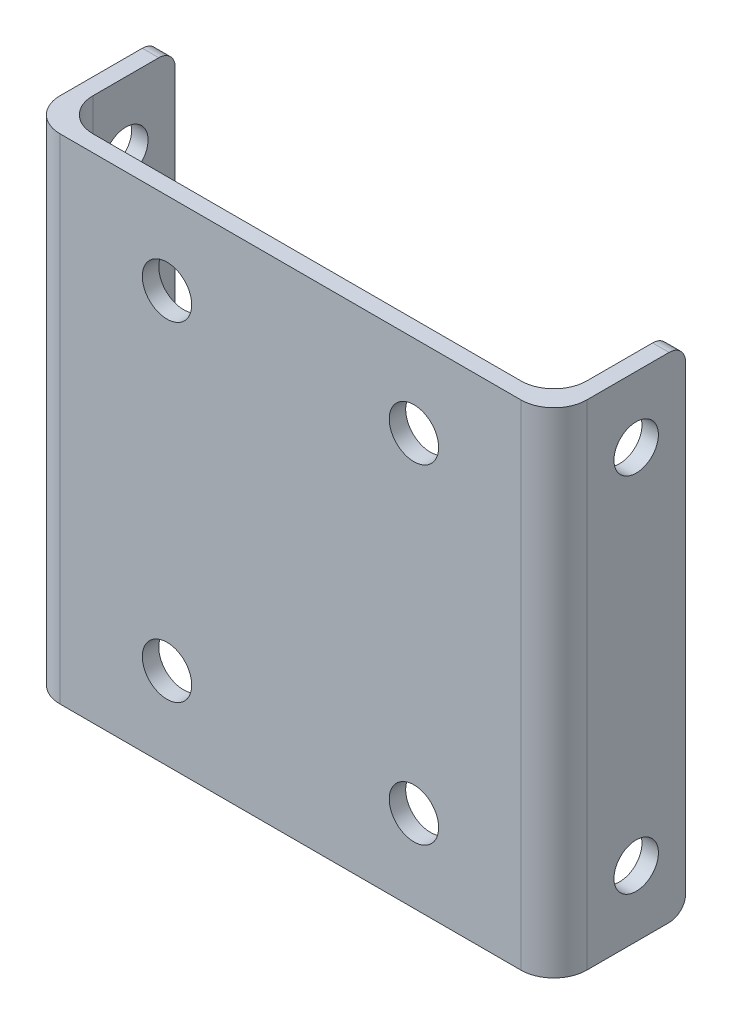
ISO-10303-21;
HEADER;
FILE_DESCRIPTION(('STEP AP214'),'2;1');
FILE_NAME('part.step','',(''),(''),'','','');
FILE_SCHEMA(('AUTOMOTIVE_DESIGN { 1 0 10303 214 1 1 1 1 }'));
ENDSEC;
DATA;
#1=APPLICATION_CONTEXT('core data for automotive mechanical design processes');
#2=APPLICATION_PROTOCOL_DEFINITION('international standard','automotive_design',2000,#1);
#3=PRODUCT_CONTEXT('',#1,'mechanical');
#4=PRODUCT('Part','Part','',(#3));
#5=PRODUCT_RELATED_PRODUCT_CATEGORY('part','',(#4));
#6=PRODUCT_DEFINITION_FORMATION('','',#4);
#7=PRODUCT_DEFINITION_CONTEXT('part definition',#1,'design');
#8=PRODUCT_DEFINITION('design','',#6,#7);
#9=PRODUCT_DEFINITION_SHAPE('','',#8);
#10=(LENGTH_UNIT() NAMED_UNIT(*) SI_UNIT(.MILLI.,.METRE.));
#11=(NAMED_UNIT(*) PLANE_ANGLE_UNIT() SI_UNIT($,.RADIAN.));
#12=(NAMED_UNIT(*) SI_UNIT($,.STERADIAN.) SOLID_ANGLE_UNIT());
#13=UNCERTAINTY_MEASURE_WITH_UNIT(LENGTH_MEASURE(1.E-05),#10,'distance_accuracy_value','');
#14=(GEOMETRIC_REPRESENTATION_CONTEXT(3) GLOBAL_UNCERTAINTY_ASSIGNED_CONTEXT((#13)) GLOBAL_UNIT_ASSIGNED_CONTEXT((#10,
#11,#12)) REPRESENTATION_CONTEXT('',''));
#15=CARTESIAN_POINT('',(0.,0.,0.));
#16=DIRECTION('',(0.,0.,1.));
#17=DIRECTION('',(1.,0.,0.));
#18=AXIS2_PLACEMENT_3D('',#15,#16,#17);
#19=CARTESIAN_POINT('',(9.50000000000006,30.,-0.5));
#20=DIRECTION('',(-1.,0.,0.));
#21=DIRECTION('',(0.,0.,1.));
#22=AXIS2_PLACEMENT_3D('',#19,#20,#21);
#23=PLANE('',#22);
#24=CARTESIAN_POINT('',(9.50000000000006,4.,-4.5));
#25=DIRECTION('',(1.,0.,0.));
#26=DIRECTION('',(0.,0.,-1.));
#27=AXIS2_PLACEMENT_3D('',#24,#25,#26);
#28=CIRCLE('',#27,1.35);
#29=CARTESIAN_POINT('',(9.50000000000006,4.,-5.85));
#30=VERTEX_POINT('',#29);
#31=EDGE_CURVE('E446',#30,#30,#28,.T.);
#32=ORIENTED_EDGE('',*,*,#31,.F.);
#33=EDGE_LOOP('',(#32));
#34=FACE_BOUND('',#33,.T.);
#35=CARTESIAN_POINT('',(9.50000000000006,26.,-4.5));
#36=DIRECTION('',(1.,0.,0.));
#37=DIRECTION('',(0.,0.,-1.));
#38=AXIS2_PLACEMENT_3D('',#35,#36,#37);
#39=CIRCLE('',#38,1.35);
#40=CARTESIAN_POINT('',(9.50000000000006,26.,-5.85));
#41=VERTEX_POINT('',#40);
#42=EDGE_CURVE('E447',#41,#41,#39,.T.);
#43=ORIENTED_EDGE('',*,*,#42,.F.);
#44=EDGE_LOOP('',(#43));
#45=FACE_BOUND('',#44,.T.);
#46=DIRECTION('',(0.,0.,-1.));
#47=VECTOR('',#46,1.);
#48=CARTESIAN_POINT('',(9.50000000000006,0.,-0.5));
#49=LINE('',#48,#47);
#50=CARTESIAN_POINT('',(9.50000000000006,0.,-1.5));
#51=VERTEX_POINT('',#50);
#52=CARTESIAN_POINT('',(9.50000000000006,0.,-6.5));
#53=VERTEX_POINT('',#52);
#54=EDGE_CURVE('E273',#51,#53,#49,.T.);
#55=ORIENTED_EDGE('',*,*,#54,.T.);
#56=CARTESIAN_POINT('',(9.50000000000006,1.,-6.5));
#57=DIRECTION('',(-1.,0.,0.));
#58=DIRECTION('',(0.,0.,1.));
#59=AXIS2_PLACEMENT_3D('',#56,#57,#58);
#60=CIRCLE('',#59,1.);
#61=CARTESIAN_POINT('',(9.50000000000006,1.,-7.5));
#62=VERTEX_POINT('',#61);
#63=EDGE_CURVE('E11',#53,#62,#60,.F.);
#64=ORIENTED_EDGE('',*,*,#63,.T.);
#65=DIRECTION('',(0.,-1.,0.));
#66=VECTOR('',#65,1.);
#67=CARTESIAN_POINT('',(9.50000000000006,30.,-7.5));
#68=LINE('',#67,#66);
#69=CARTESIAN_POINT('',(9.50000000000006,29.,-7.5));
#70=VERTEX_POINT('',#69);
#71=EDGE_CURVE('E189',#70,#62,#68,.T.);
#72=ORIENTED_EDGE('',*,*,#71,.F.);
#73=CARTESIAN_POINT('',(9.50000000000006,29.,-6.5));
#74=DIRECTION('',(-1.,0.,0.));
#75=DIRECTION('',(0.,0.,1.));
#76=AXIS2_PLACEMENT_3D('',#73,#74,#75);
#77=CIRCLE('',#76,1.);
#78=CARTESIAN_POINT('',(9.50000000000006,30.,-6.5));
#79=VERTEX_POINT('',#78);
#80=EDGE_CURVE('E40',#70,#79,#77,.F.);
#81=ORIENTED_EDGE('',*,*,#80,.T.);
#82=DIRECTION('',(0.,0.,-1.));
#83=VECTOR('',#82,1.);
#84=CARTESIAN_POINT('',(9.50000000000006,30.,-0.5));
#85=LINE('',#84,#83);
#86=CARTESIAN_POINT('',(9.50000000000006,30.,-1.5));
#87=VERTEX_POINT('',#86);
#88=EDGE_CURVE('E170',#87,#79,#85,.T.);
#89=ORIENTED_EDGE('',*,*,#88,.F.);
#90=DIRECTION('',(0.,-1.,0.));
#91=VECTOR('',#90,1.);
#92=CARTESIAN_POINT('',(9.50000000000006,30.,-1.5));
#93=LINE('',#92,#91);
#94=EDGE_CURVE('E206',#87,#51,#93,.T.);
#95=ORIENTED_EDGE('',*,*,#94,.T.);
#96=EDGE_LOOP('',(#55,#64,#72,#81,#89,#95));
#97=FACE_BOUND('',#96,.T.);
#98=ADVANCED_FACE('F32',(#34,#45,#97),#23,.F.);
#99=CARTESIAN_POINT('',(9.50000000000006,30.,-7.5));
#100=DIRECTION('',(0.,0.,1.));
#101=DIRECTION('',(1.,0.,0.));
#102=AXIS2_PLACEMENT_3D('',#99,#100,#101);
#103=PLANE('',#102);
#104=ORIENTED_EDGE('',*,*,#71,.T.);
#105=DIRECTION('',(-1.,0.,0.));
#106=VECTOR('',#105,1.);
#107=CARTESIAN_POINT('',(9.50000000000006,1.,-7.5));
#108=LINE('',#107,#106);
#109=CARTESIAN_POINT('',(8.50000000000006,1.,-7.5));
#110=VERTEX_POINT('',#109);
#111=EDGE_CURVE('E245',#62,#110,#108,.T.);
#112=ORIENTED_EDGE('',*,*,#111,.T.);
#113=DIRECTION('',(0.,-1.,0.));
#114=VECTOR('',#113,1.);
#115=CARTESIAN_POINT('',(8.50000000000006,30.,-7.5));
#116=LINE('',#115,#114);
#117=CARTESIAN_POINT('',(8.50000000000006,29.,-7.5));
#118=VERTEX_POINT('',#117);
#119=EDGE_CURVE('E186',#118,#110,#116,.T.);
#120=ORIENTED_EDGE('',*,*,#119,.F.);
#121=DIRECTION('',(-1.,0.,0.));
#122=VECTOR('',#121,1.);
#123=CARTESIAN_POINT('',(9.50000000000006,29.,-7.5));
#124=LINE('',#123,#122);
#125=EDGE_CURVE('E52',#118,#70,#124,.F.);
#126=ORIENTED_EDGE('',*,*,#125,.T.);
#127=EDGE_LOOP('',(#104,#112,#120,#126));
#128=FACE_BOUND('',#127,.T.);
#129=ADVANCED_FACE('F263',(#128),#103,.F.);
#130=CARTESIAN_POINT('',(8.50000000000006,30.,-0.5));
#131=DIRECTION('',(1.,0.,0.));
#132=DIRECTION('',(0.,0.,-1.));
#133=AXIS2_PLACEMENT_3D('',#130,#131,#132);
#134=PLANE('',#133);
#135=CARTESIAN_POINT('',(8.50000000000006,4.,-4.5));
#136=DIRECTION('',(1.,0.,0.));
#137=DIRECTION('',(0.,0.,-1.));
#138=AXIS2_PLACEMENT_3D('',#135,#136,#137);
#139=CIRCLE('',#138,1.35);
#140=CARTESIAN_POINT('',(8.50000000000006,4.,-5.85));
#141=VERTEX_POINT('',#140);
#142=EDGE_CURVE('E370',#141,#141,#139,.T.);
#143=ORIENTED_EDGE('',*,*,#142,.T.);
#144=EDGE_LOOP('',(#143));
#145=FACE_BOUND('',#144,.T.);
#146=CARTESIAN_POINT('',(8.50000000000006,26.,-4.5));
#147=DIRECTION('',(1.,0.,0.));
#148=DIRECTION('',(0.,0.,-1.));
#149=AXIS2_PLACEMENT_3D('',#146,#147,#148);
#150=CIRCLE('',#149,1.35);
#151=CARTESIAN_POINT('',(8.50000000000006,26.,-5.85));
#152=VERTEX_POINT('',#151);
#153=EDGE_CURVE('E373',#152,#152,#150,.T.);
#154=ORIENTED_EDGE('',*,*,#153,.T.);
#155=EDGE_LOOP('',(#154));
#156=FACE_BOUND('',#155,.T.);
#157=ORIENTED_EDGE('',*,*,#119,.T.);
#158=CARTESIAN_POINT('',(8.50000000000006,1.,-6.5));
#159=DIRECTION('',(1.,0.,0.));
#160=DIRECTION('',(0.,0.,-1.));
#161=AXIS2_PLACEMENT_3D('',#158,#159,#160);
#162=CIRCLE('',#161,1.);
#163=CARTESIAN_POINT('',(8.50000000000006,0.,-6.5));
#164=VERTEX_POINT('',#163);
#165=EDGE_CURVE('E250',#110,#164,#162,.F.);
#166=ORIENTED_EDGE('',*,*,#165,.T.);
#167=DIRECTION('',(0.,0.,1.));
#168=VECTOR('',#167,1.);
#169=CARTESIAN_POINT('',(8.50000000000006,0.,-0.5));
#170=LINE('',#169,#168);
#171=CARTESIAN_POINT('',(8.50000000000006,0.,-2.5));
#172=VERTEX_POINT('',#171);
#173=EDGE_CURVE('E269',#164,#172,#170,.T.);
#174=ORIENTED_EDGE('',*,*,#173,.T.);
#175=DIRECTION('',(0.,-1.,0.));
#176=VECTOR('',#175,1.);
#177=CARTESIAN_POINT('',(8.50000000000006,30.,-2.5));
#178=LINE('',#177,#176);
#179=CARTESIAN_POINT('',(8.50000000000006,30.,-2.5));
#180=VERTEX_POINT('',#179);
#181=EDGE_CURVE('E209',#172,#180,#178,.F.);
#182=ORIENTED_EDGE('',*,*,#181,.T.);
#183=DIRECTION('',(0.,0.,1.));
#184=VECTOR('',#183,1.);
#185=CARTESIAN_POINT('',(8.50000000000006,30.,-0.5));
#186=LINE('',#185,#184);
#187=CARTESIAN_POINT('',(8.50000000000006,30.,-6.5));
#188=VERTEX_POINT('',#187);
#189=EDGE_CURVE('E174',#188,#180,#186,.T.);
#190=ORIENTED_EDGE('',*,*,#189,.F.);
#191=CARTESIAN_POINT('',(8.50000000000006,29.,-6.5));
#192=DIRECTION('',(1.,0.,0.));
#193=DIRECTION('',(0.,0.,-1.));
#194=AXIS2_PLACEMENT_3D('',#191,#192,#193);
#195=CIRCLE('',#194,1.);
#196=EDGE_CURVE('E248',#188,#118,#195,.F.);
#197=ORIENTED_EDGE('',*,*,#196,.T.);
#198=EDGE_LOOP('',(#157,#166,#174,#182,#190,#197));
#199=FACE_BOUND('',#198,.T.);
#200=ADVANCED_FACE('F262',(#145,#156,#199),#134,.F.);
#201=CARTESIAN_POINT('',(-21.4999999999999,30.,-0.500000000000001));
#202=DIRECTION('',(0.,0.,1.));
#203=DIRECTION('',(1.,0.,0.));
#204=AXIS2_PLACEMENT_3D('',#201,#202,#203);
#205=PLANE('',#204);
#206=CARTESIAN_POINT('',(-13.9999999999999,5.,-0.500000000000001));
#207=DIRECTION('',(0.,0.,1.));
#208=DIRECTION('',(1.,0.,0.));
#209=AXIS2_PLACEMENT_3D('',#206,#207,#208);
#210=CIRCLE('',#209,1.5);
#211=CARTESIAN_POINT('',(-12.4999999999999,5.,-0.500000000000001));
#212=VERTEX_POINT('',#211);
#213=EDGE_CURVE('E379',#212,#212,#210,.T.);
#214=ORIENTED_EDGE('',*,*,#213,.T.);
#215=EDGE_LOOP('',(#214));
#216=FACE_BOUND('',#215,.T.);
#217=CARTESIAN_POINT('',(1.00000000000006,5.,-0.5));
#218=DIRECTION('',(0.,0.,1.));
#219=DIRECTION('',(1.,0.,0.));
#220=AXIS2_PLACEMENT_3D('',#217,#218,#219);
#221=CIRCLE('',#220,1.5);
#222=CARTESIAN_POINT('',(2.50000000000006,5.,-0.5));
#223=VERTEX_POINT('',#222);
#224=EDGE_CURVE('E391',#223,#223,#221,.T.);
#225=ORIENTED_EDGE('',*,*,#224,.T.);
#226=EDGE_LOOP('',(#225));
#227=FACE_BOUND('',#226,.T.);
#228=CARTESIAN_POINT('',(1.00000000000006,25.,-0.5));
#229=DIRECTION('',(0.,0.,1.));
#230=DIRECTION('',(1.,0.,0.));
#231=AXIS2_PLACEMENT_3D('',#228,#229,#230);
#232=CIRCLE('',#231,1.5);
#233=CARTESIAN_POINT('',(2.50000000000005,25.,-0.5));
#234=VERTEX_POINT('',#233);
#235=EDGE_CURVE('E397',#234,#234,#232,.T.);
#236=ORIENTED_EDGE('',*,*,#235,.T.);
#237=EDGE_LOOP('',(#236));
#238=FACE_BOUND('',#237,.T.);
#239=CARTESIAN_POINT('',(-13.9999999999999,25.,-0.500000000000001));
#240=DIRECTION('',(0.,0.,1.));
#241=DIRECTION('',(1.,0.,0.));
#242=AXIS2_PLACEMENT_3D('',#239,#240,#241);
#243=CIRCLE('',#242,1.5);
#244=CARTESIAN_POINT('',(-12.4999999999999,25.,-0.500000000000001));
#245=VERTEX_POINT('',#244);
#246=EDGE_CURVE('E277',#245,#245,#243,.T.);
#247=ORIENTED_EDGE('',*,*,#246,.T.);
#248=EDGE_LOOP('',(#247));
#249=FACE_BOUND('',#248,.T.);
#250=DIRECTION('',(-1.,0.,0.));
#251=VECTOR('',#250,1.);
#252=CARTESIAN_POINT('',(-21.4999999999999,0.,-0.500000000000001));
#253=LINE('',#252,#251);
#254=CARTESIAN_POINT('',(6.50000000000005,0.,-0.5));
#255=VERTEX_POINT('',#254);
#256=CARTESIAN_POINT('',(-19.4999999999999,0.,-0.500000000000001));
#257=VERTEX_POINT('',#256);
#258=EDGE_CURVE('E272',#255,#257,#253,.T.);
#259=ORIENTED_EDGE('',*,*,#258,.T.);
#260=DIRECTION('',(0.,-1.,0.));
#261=VECTOR('',#260,1.);
#262=CARTESIAN_POINT('',(-19.4999999999999,30.,-0.500000000000001));
#263=LINE('',#262,#261);
#264=CARTESIAN_POINT('',(-19.4999999999999,30.,-0.500000000000001));
#265=VERTEX_POINT('',#264);
#266=EDGE_CURVE('E204',#257,#265,#263,.F.);
#267=ORIENTED_EDGE('',*,*,#266,.T.);
#268=DIRECTION('',(-1.,0.,0.));
#269=VECTOR('',#268,1.);
#270=CARTESIAN_POINT('',(-21.4999999999999,30.,-0.500000000000001));
#271=LINE('',#270,#269);
#272=CARTESIAN_POINT('',(6.50000000000005,30.,-0.5));
#273=VERTEX_POINT('',#272);
#274=EDGE_CURVE('E307',#273,#265,#271,.T.);
#275=ORIENTED_EDGE('',*,*,#274,.F.);
#276=DIRECTION('',(0.,-1.,0.));
#277=VECTOR('',#276,1.);
#278=CARTESIAN_POINT('',(6.50000000000005,0.,-0.5));
#279=LINE('',#278,#277);
#280=EDGE_CURVE('E201',#273,#255,#279,.T.);
#281=ORIENTED_EDGE('',*,*,#280,.T.);
#282=EDGE_LOOP('',(#259,#267,#275,#281));
#283=FACE_BOUND('',#282,.T.);
#284=ADVANCED_FACE('F359',(#216,#227,#238,#249,#283),#205,.F.);
#285=CARTESIAN_POINT('',(-21.4999999999999,30.,-0.500000000000001));
#286=DIRECTION('',(-1.,0.,0.));
#287=DIRECTION('',(0.,0.,1.));
#288=AXIS2_PLACEMENT_3D('',#285,#286,#287);
#289=PLANE('',#288);
#290=CARTESIAN_POINT('',(-21.4999999999999,4.,-4.5));
#291=DIRECTION('',(-1.,0.,0.));
#292=DIRECTION('',(0.,0.,1.));
#293=AXIS2_PLACEMENT_3D('',#290,#291,#292);
#294=CIRCLE('',#293,1.35);
#295=CARTESIAN_POINT('',(-21.4999999999999,4.,-3.15));
#296=VERTEX_POINT('',#295);
#297=EDGE_CURVE('E448',#296,#296,#294,.T.);
#298=ORIENTED_EDGE('',*,*,#297,.T.);
#299=EDGE_LOOP('',(#298));
#300=FACE_BOUND('',#299,.T.);
#301=CARTESIAN_POINT('',(-21.4999999999999,26.,-4.5));
#302=DIRECTION('',(-1.,0.,0.));
#303=DIRECTION('',(0.,0.,1.));
#304=AXIS2_PLACEMENT_3D('',#301,#302,#303);
#305=CIRCLE('',#304,1.35);
#306=CARTESIAN_POINT('',(-21.4999999999999,26.,-3.15));
#307=VERTEX_POINT('',#306);
#308=EDGE_CURVE('E376',#307,#307,#305,.T.);
#309=ORIENTED_EDGE('',*,*,#308,.T.);
#310=EDGE_LOOP('',(#309));
#311=FACE_BOUND('',#310,.T.);
#312=DIRECTION('',(0.,-1.,0.));
#313=VECTOR('',#312,1.);
#314=CARTESIAN_POINT('',(-21.4999999999999,30.,-7.5));
#315=LINE('',#314,#313);
#316=CARTESIAN_POINT('',(-21.4999999999999,29.,-7.5));
#317=VERTEX_POINT('',#316);
#318=CARTESIAN_POINT('',(-21.4999999999999,1.,-7.5));
#319=VERTEX_POINT('',#318);
#320=EDGE_CURVE('E183',#317,#319,#315,.T.);
#321=ORIENTED_EDGE('',*,*,#320,.F.);
#322=CARTESIAN_POINT('',(-21.4999999999999,29.,-6.5));
#323=DIRECTION('',(-1.,0.,0.));
#324=DIRECTION('',(0.,0.,1.));
#325=AXIS2_PLACEMENT_3D('',#322,#323,#324);
#326=CIRCLE('',#325,1.);
#327=CARTESIAN_POINT('',(-21.4999999999999,30.,-6.49999999999999));
#328=VERTEX_POINT('',#327);
#329=EDGE_CURVE('E238',#317,#328,#326,.F.);
#330=ORIENTED_EDGE('',*,*,#329,.T.);
#331=DIRECTION('',(0.,0.,-1.));
#332=VECTOR('',#331,1.);
#333=CARTESIAN_POINT('',(-21.4999999999999,30.,-0.500000000000001));
#334=LINE('',#333,#332);
#335=CARTESIAN_POINT('',(-21.4999999999999,30.,-2.5));
#336=VERTEX_POINT('',#335);
#337=EDGE_CURVE('E304',#336,#328,#334,.T.);
#338=ORIENTED_EDGE('',*,*,#337,.F.);
#339=DIRECTION('',(0.,-1.,0.));
#340=VECTOR('',#339,1.);
#341=CARTESIAN_POINT('',(-21.4999999999999,0.,-2.5));
#342=LINE('',#341,#340);
#343=CARTESIAN_POINT('',(-21.4999999999999,0.,-2.5));
#344=VERTEX_POINT('',#343);
#345=EDGE_CURVE('E198',#336,#344,#342,.T.);
#346=ORIENTED_EDGE('',*,*,#345,.T.);
#347=DIRECTION('',(0.,0.,-1.));
#348=VECTOR('',#347,1.);
#349=CARTESIAN_POINT('',(-21.4999999999999,0.,-0.500000000000001));
#350=LINE('',#349,#348);
#351=CARTESIAN_POINT('',(-21.4999999999999,0.,-6.49999999999999));
#352=VERTEX_POINT('',#351);
#353=EDGE_CURVE('E176',#344,#352,#350,.T.);
#354=ORIENTED_EDGE('',*,*,#353,.T.);
#355=CARTESIAN_POINT('',(-21.4999999999999,1.,-6.5));
#356=DIRECTION('',(-1.,0.,0.));
#357=DIRECTION('',(0.,0.,1.));
#358=AXIS2_PLACEMENT_3D('',#355,#356,#357);
#359=CIRCLE('',#358,1.);
#360=EDGE_CURVE('E236',#352,#319,#359,.F.);
#361=ORIENTED_EDGE('',*,*,#360,.T.);
#362=EDGE_LOOP('',(#321,#330,#338,#346,#354,#361));
#363=FACE_BOUND('',#362,.T.);
#364=ADVANCED_FACE('F285',(#300,#311,#363),#289,.F.);
#365=CARTESIAN_POINT('',(-22.4999999999999,30.,-7.5));
#366=DIRECTION('',(0.,0.,1.));
#367=DIRECTION('',(1.,0.,0.));
#368=AXIS2_PLACEMENT_3D('',#365,#366,#367);
#369=PLANE('',#368);
#370=DIRECTION('',(0.,-1.,0.));
#371=VECTOR('',#370,1.);
#372=CARTESIAN_POINT('',(-22.4999999999999,30.,-7.5));
#373=LINE('',#372,#371);
#374=CARTESIAN_POINT('',(-22.4999999999999,29.,-7.5));
#375=VERTEX_POINT('',#374);
#376=CARTESIAN_POINT('',(-22.4999999999999,1.,-7.5));
#377=VERTEX_POINT('',#376);
#378=EDGE_CURVE('E180',#375,#377,#373,.T.);
#379=ORIENTED_EDGE('',*,*,#378,.F.);
#380=DIRECTION('',(-1.,0.,0.));
#381=VECTOR('',#380,1.);
#382=CARTESIAN_POINT('',(-21.4999999999999,29.,-7.5));
#383=LINE('',#382,#381);
#384=EDGE_CURVE('E234',#375,#317,#383,.F.);
#385=ORIENTED_EDGE('',*,*,#384,.T.);
#386=ORIENTED_EDGE('',*,*,#320,.T.);
#387=DIRECTION('',(-1.,0.,0.));
#388=VECTOR('',#387,1.);
#389=CARTESIAN_POINT('',(-22.4999999999999,1.,-7.5));
#390=LINE('',#389,#388);
#391=EDGE_CURVE('E231',#319,#377,#390,.T.);
#392=ORIENTED_EDGE('',*,*,#391,.T.);
#393=EDGE_LOOP('',(#379,#385,#386,#392));
#394=FACE_BOUND('',#393,.T.);
#395=ADVANCED_FACE('F294',(#394),#369,.F.);
#396=CARTESIAN_POINT('',(-22.4999999999999,30.,-0.499999999999996));
#397=DIRECTION('',(1.,0.,0.));
#398=DIRECTION('',(0.,0.,-1.));
#399=AXIS2_PLACEMENT_3D('',#396,#397,#398);
#400=PLANE('',#399);
#401=CARTESIAN_POINT('',(-22.4999999999999,4.,-4.5));
#402=DIRECTION('',(1.,0.,0.));
#403=DIRECTION('',(0.,0.,-1.));
#404=AXIS2_PLACEMENT_3D('',#401,#402,#403);
#405=CIRCLE('',#404,1.35);
#406=CARTESIAN_POINT('',(-22.4999999999999,4.,-5.85));
#407=VERTEX_POINT('',#406);
#408=EDGE_CURVE('E452',#407,#407,#405,.T.);
#409=ORIENTED_EDGE('',*,*,#408,.T.);
#410=EDGE_LOOP('',(#409));
#411=FACE_BOUND('',#410,.T.);
#412=CARTESIAN_POINT('',(-22.4999999999999,26.,-4.5));
#413=DIRECTION('',(1.,0.,0.));
#414=DIRECTION('',(0.,0.,-1.));
#415=AXIS2_PLACEMENT_3D('',#412,#413,#414);
#416=CIRCLE('',#415,1.35);
#417=CARTESIAN_POINT('',(-22.4999999999999,26.,-5.85));
#418=VERTEX_POINT('',#417);
#419=EDGE_CURVE('E382',#418,#418,#416,.T.);
#420=ORIENTED_EDGE('',*,*,#419,.T.);
#421=EDGE_LOOP('',(#420));
#422=FACE_BOUND('',#421,.T.);
#423=DIRECTION('',(0.,0.,1.));
#424=VECTOR('',#423,1.);
#425=CARTESIAN_POINT('',(-22.4999999999999,30.,-0.499999999999996));
#426=LINE('',#425,#424);
#427=CARTESIAN_POINT('',(-22.4999999999999,30.,-6.5));
#428=VERTEX_POINT('',#427);
#429=CARTESIAN_POINT('',(-22.4999999999999,30.,-1.5));
#430=VERTEX_POINT('',#429);
#431=EDGE_CURVE('E299',#428,#430,#426,.T.);
#432=ORIENTED_EDGE('',*,*,#431,.F.);
#433=CARTESIAN_POINT('',(-22.4999999999999,29.,-6.5));
#434=DIRECTION('',(1.,0.,0.));
#435=DIRECTION('',(0.,0.,-1.));
#436=AXIS2_PLACEMENT_3D('',#433,#434,#435);
#437=CIRCLE('',#436,1.);
#438=EDGE_CURVE('E229',#428,#375,#437,.F.);
#439=ORIENTED_EDGE('',*,*,#438,.T.);
#440=ORIENTED_EDGE('',*,*,#378,.T.);
#441=CARTESIAN_POINT('',(-22.4999999999999,1.,-6.5));
#442=DIRECTION('',(1.,0.,0.));
#443=DIRECTION('',(0.,0.,-1.));
#444=AXIS2_PLACEMENT_3D('',#441,#442,#443);
#445=CIRCLE('',#444,1.);
#446=CARTESIAN_POINT('',(-22.4999999999999,0.,-6.5));
#447=VERTEX_POINT('',#446);
#448=EDGE_CURVE('E227',#377,#447,#445,.F.);
#449=ORIENTED_EDGE('',*,*,#448,.T.);
#450=DIRECTION('',(0.,0.,1.));
#451=VECTOR('',#450,1.);
#452=CARTESIAN_POINT('',(-22.4999999999999,0.,-0.499999999999996));
#453=LINE('',#452,#451);
#454=CARTESIAN_POINT('',(-22.4999999999999,0.,-1.5));
#455=VERTEX_POINT('',#454);
#456=EDGE_CURVE('E171',#447,#455,#453,.T.);
#457=ORIENTED_EDGE('',*,*,#456,.T.);
#458=DIRECTION('',(0.,-1.,0.));
#459=VECTOR('',#458,1.);
#460=CARTESIAN_POINT('',(-22.4999999999999,30.,-1.5));
#461=LINE('',#460,#459);
#462=EDGE_CURVE('E152',#455,#430,#461,.F.);
#463=ORIENTED_EDGE('',*,*,#462,.T.);
#464=EDGE_LOOP('',(#432,#439,#440,#449,#457,#463));
#465=FACE_BOUND('',#464,.T.);
#466=ADVANCED_FACE('F298',(#411,#422,#465),#400,.F.);
#467=CARTESIAN_POINT('',(-22.4999999999999,30.,0.499999999999999));
#468=DIRECTION('',(0.,0.,-1.));
#469=DIRECTION('',(-1.,0.,0.));
#470=AXIS2_PLACEMENT_3D('',#467,#468,#469);
#471=PLANE('',#470);
#472=CARTESIAN_POINT('',(-13.9999999999999,5.,0.5));
#473=DIRECTION('',(0.,0.,1.));
#474=DIRECTION('',(1.,0.,0.));
#475=AXIS2_PLACEMENT_3D('',#472,#473,#474);
#476=CIRCLE('',#475,1.5);
#477=CARTESIAN_POINT('',(-12.4999999999999,5.,0.5));
#478=VERTEX_POINT('',#477);
#479=EDGE_CURVE('E375',#478,#478,#476,.T.);
#480=ORIENTED_EDGE('',*,*,#479,.F.);
#481=EDGE_LOOP('',(#480));
#482=FACE_BOUND('',#481,.T.);
#483=CARTESIAN_POINT('',(1.00000000000006,5.,0.5));
#484=DIRECTION('',(0.,0.,1.));
#485=DIRECTION('',(1.,0.,0.));
#486=AXIS2_PLACEMENT_3D('',#483,#484,#485);
#487=CIRCLE('',#486,1.5);
#488=CARTESIAN_POINT('',(2.50000000000006,5.,0.5));
#489=VERTEX_POINT('',#488);
#490=EDGE_CURVE('E388',#489,#489,#487,.T.);
#491=ORIENTED_EDGE('',*,*,#490,.F.);
#492=EDGE_LOOP('',(#491));
#493=FACE_BOUND('',#492,.T.);
#494=CARTESIAN_POINT('',(1.00000000000006,25.,0.5));
#495=DIRECTION('',(0.,0.,1.));
#496=DIRECTION('',(1.,0.,0.));
#497=AXIS2_PLACEMENT_3D('',#494,#495,#496);
#498=CIRCLE('',#497,1.5);
#499=CARTESIAN_POINT('',(2.50000000000005,25.,0.5));
#500=VERTEX_POINT('',#499);
#501=EDGE_CURVE('E394',#500,#500,#498,.T.);
#502=ORIENTED_EDGE('',*,*,#501,.F.);
#503=EDGE_LOOP('',(#502));
#504=FACE_BOUND('',#503,.T.);
#505=CARTESIAN_POINT('',(-13.9999999999999,25.,0.5));
#506=DIRECTION('',(0.,0.,1.));
#507=DIRECTION('',(1.,0.,0.));
#508=AXIS2_PLACEMENT_3D('',#505,#506,#507);
#509=CIRCLE('',#508,1.5);
#510=CARTESIAN_POINT('',(-12.4999999999999,25.,0.5));
#511=VERTEX_POINT('',#510);
#512=EDGE_CURVE('E400',#511,#511,#509,.T.);
#513=ORIENTED_EDGE('',*,*,#512,.F.);
#514=EDGE_LOOP('',(#513));
#515=FACE_BOUND('',#514,.T.);
#516=DIRECTION('',(1.,0.,0.));
#517=VECTOR('',#516,1.);
#518=CARTESIAN_POINT('',(-22.4999999999999,30.,0.499999999999999));
#519=LINE('',#518,#517);
#520=CARTESIAN_POINT('',(-20.4999999999999,30.,0.499999999999999));
#521=VERTEX_POINT('',#520);
#522=CARTESIAN_POINT('',(7.50000000000006,30.,0.5));
#523=VERTEX_POINT('',#522);
#524=EDGE_CURVE('E165',#521,#523,#519,.T.);
#525=ORIENTED_EDGE('',*,*,#524,.F.);
#526=DIRECTION('',(0.,-1.,0.));
#527=VECTOR('',#526,1.);
#528=CARTESIAN_POINT('',(-20.4999999999999,30.,0.499999999999999));
#529=LINE('',#528,#527);
#530=CARTESIAN_POINT('',(-20.4999999999999,0.,0.499999999999999));
#531=VERTEX_POINT('',#530);
#532=EDGE_CURVE('E150',#521,#531,#529,.T.);
#533=ORIENTED_EDGE('',*,*,#532,.T.);
#534=DIRECTION('',(1.,0.,0.));
#535=VECTOR('',#534,1.);
#536=CARTESIAN_POINT('',(-22.4999999999999,0.,0.499999999999999));
#537=LINE('',#536,#535);
#538=CARTESIAN_POINT('',(7.50000000000006,0.,0.5));
#539=VERTEX_POINT('',#538);
#540=EDGE_CURVE('E162',#531,#539,#537,.T.);
#541=ORIENTED_EDGE('',*,*,#540,.T.);
#542=DIRECTION('',(0.,-1.,0.));
#543=VECTOR('',#542,1.);
#544=CARTESIAN_POINT('',(7.50000000000006,30.,0.5));
#545=LINE('',#544,#543);
#546=EDGE_CURVE('E166',#539,#523,#545,.F.);
#547=ORIENTED_EDGE('',*,*,#546,.T.);
#548=EDGE_LOOP('',(#525,#533,#541,#547));
#549=FACE_BOUND('',#548,.T.);
#550=ADVANCED_FACE('F161',(#482,#493,#504,#515,#549),#471,.F.);
#551=CARTESIAN_POINT('',(0.,30.,0.));
#552=DIRECTION('',(0.,1.,0.));
#553=DIRECTION('',(0.,0.,1.));
#554=AXIS2_PLACEMENT_3D('',#551,#552,#553);
#555=PLANE('',#554);
#556=ORIENTED_EDGE('',*,*,#337,.T.);
#557=DIRECTION('',(-1.,0.,0.));
#558=VECTOR('',#557,1.);
#559=CARTESIAN_POINT('',(-22.4999999999999,30.,-6.5));
#560=LINE('',#559,#558);
#561=EDGE_CURVE('E224',#328,#428,#560,.T.);
#562=ORIENTED_EDGE('',*,*,#561,.T.);
#563=ORIENTED_EDGE('',*,*,#431,.T.);
#564=CARTESIAN_POINT('',(-20.4999999999999,30.,-1.5));
#565=DIRECTION('',(0.,1.,0.));
#566=DIRECTION('',(0.,0.,1.));
#567=AXIS2_PLACEMENT_3D('',#564,#565,#566);
#568=CIRCLE('',#567,2.);
#569=EDGE_CURVE('E196',#430,#521,#568,.T.);
#570=ORIENTED_EDGE('',*,*,#569,.T.);
#571=ORIENTED_EDGE('',*,*,#524,.T.);
#572=CARTESIAN_POINT('',(7.50000000000006,30.,-1.5));
#573=DIRECTION('',(0.,1.,0.));
#574=DIRECTION('',(0.,0.,1.));
#575=AXIS2_PLACEMENT_3D('',#572,#573,#574);
#576=CIRCLE('',#575,2.);
#577=EDGE_CURVE('E194',#523,#87,#576,.T.);
#578=ORIENTED_EDGE('',*,*,#577,.T.);
#579=ORIENTED_EDGE('',*,*,#88,.T.);
#580=DIRECTION('',(-1.,0.,0.));
#581=VECTOR('',#580,1.);
#582=CARTESIAN_POINT('',(8.50000000000006,30.,-6.5));
#583=LINE('',#582,#581);
#584=EDGE_CURVE('E221',#79,#188,#583,.T.);
#585=ORIENTED_EDGE('',*,*,#584,.T.);
#586=ORIENTED_EDGE('',*,*,#189,.T.);
#587=CARTESIAN_POINT('',(6.50000000000005,30.,-2.5));
#588=DIRECTION('',(0.,1.,0.));
#589=DIRECTION('',(0.,0.,1.));
#590=AXIS2_PLACEMENT_3D('',#587,#588,#589);
#591=CIRCLE('',#590,2.);
#592=EDGE_CURVE('E219',#180,#273,#591,.F.);
#593=ORIENTED_EDGE('',*,*,#592,.T.);
#594=ORIENTED_EDGE('',*,*,#274,.T.);
#595=CARTESIAN_POINT('',(-19.4999999999999,30.,-2.5));
#596=DIRECTION('',(0.,1.,0.));
#597=DIRECTION('',(0.,0.,1.));
#598=AXIS2_PLACEMENT_3D('',#595,#596,#597);
#599=CIRCLE('',#598,2.);
#600=EDGE_CURVE('E214',#265,#336,#599,.F.);
#601=ORIENTED_EDGE('',*,*,#600,.T.);
#602=EDGE_LOOP('',(#556,#562,#563,#570,#571,#578,#579,#585,#586,#593,#594,#601));
#603=FACE_BOUND('',#602,.T.);
#604=ADVANCED_FACE('F258',(#603),#555,.T.);
#605=CARTESIAN_POINT('',(0.,0.,0.));
#606=DIRECTION('',(0.,1.,0.));
#607=DIRECTION('',(0.,0.,1.));
#608=AXIS2_PLACEMENT_3D('',#605,#606,#607);
#609=PLANE('',#608);
#610=ORIENTED_EDGE('',*,*,#456,.F.);
#611=DIRECTION('',(-1.,0.,0.));
#612=VECTOR('',#611,1.);
#613=CARTESIAN_POINT('',(0.,0.,-6.5));
#614=LINE('',#613,#612);
#615=EDGE_CURVE('E242',#447,#352,#614,.F.);
#616=ORIENTED_EDGE('',*,*,#615,.T.);
#617=ORIENTED_EDGE('',*,*,#353,.F.);
#618=CARTESIAN_POINT('',(-19.4999999999999,0.,-2.5));
#619=DIRECTION('',(0.,1.,0.));
#620=DIRECTION('',(0.,0.,1.));
#621=AXIS2_PLACEMENT_3D('',#618,#619,#620);
#622=CIRCLE('',#621,2.);
#623=EDGE_CURVE('E212',#344,#257,#622,.T.);
#624=ORIENTED_EDGE('',*,*,#623,.T.);
#625=ORIENTED_EDGE('',*,*,#258,.F.);
#626=CARTESIAN_POINT('',(6.50000000000005,0.,-2.5));
#627=DIRECTION('',(0.,1.,0.));
#628=DIRECTION('',(0.,0.,1.));
#629=AXIS2_PLACEMENT_3D('',#626,#627,#628);
#630=CIRCLE('',#629,2.);
#631=EDGE_CURVE('E216',#255,#172,#630,.T.);
#632=ORIENTED_EDGE('',*,*,#631,.T.);
#633=ORIENTED_EDGE('',*,*,#173,.F.);
#634=DIRECTION('',(-1.,0.,0.));
#635=VECTOR('',#634,1.);
#636=CARTESIAN_POINT('',(0.,0.,-6.5));
#637=LINE('',#636,#635);
#638=EDGE_CURVE('E240',#164,#53,#637,.F.);
#639=ORIENTED_EDGE('',*,*,#638,.T.);
#640=ORIENTED_EDGE('',*,*,#54,.F.);
#641=CARTESIAN_POINT('',(7.50000000000006,0.,-1.5));
#642=DIRECTION('',(0.,1.,0.));
#643=DIRECTION('',(0.,0.,1.));
#644=AXIS2_PLACEMENT_3D('',#641,#642,#643);
#645=CIRCLE('',#644,2.);
#646=EDGE_CURVE('E156',#51,#539,#645,.F.);
#647=ORIENTED_EDGE('',*,*,#646,.T.);
#648=ORIENTED_EDGE('',*,*,#540,.F.);
#649=CARTESIAN_POINT('',(-20.4999999999999,0.,-1.5));
#650=DIRECTION('',(0.,1.,0.));
#651=DIRECTION('',(0.,0.,1.));
#652=AXIS2_PLACEMENT_3D('',#649,#650,#651);
#653=CIRCLE('',#652,2.);
#654=EDGE_CURVE('E146',#531,#455,#653,.F.);
#655=ORIENTED_EDGE('',*,*,#654,.T.);
#656=EDGE_LOOP('',(#610,#616,#617,#624,#625,#632,#633,#639,#640,#647,#648,#655));
#657=FACE_BOUND('',#656,.T.);
#658=ADVANCED_FACE('F168',(#657),#609,.F.);
#659=CARTESIAN_POINT('',(-20.4999999999999,30.,-1.5));
#660=DIRECTION('',(0.,-1.,0.));
#661=DIRECTION('',(0.,0.,-1.));
#662=AXIS2_PLACEMENT_3D('',#659,#660,#661);
#663=CYLINDRICAL_SURFACE('',#662,2.);
#664=ORIENTED_EDGE('',*,*,#569,.F.);
#665=ORIENTED_EDGE('',*,*,#462,.F.);
#666=ORIENTED_EDGE('',*,*,#654,.F.);
#667=ORIENTED_EDGE('',*,*,#532,.F.);
#668=EDGE_LOOP('',(#664,#665,#666,#667));
#669=FACE_BOUND('',#668,.T.);
#670=ADVANCED_FACE('F149',(#669),#663,.T.);
#671=CARTESIAN_POINT('',(-19.4999999999999,30.,-2.5));
#672=DIRECTION('',(0.,1.,0.));
#673=DIRECTION('',(0.,0.,1.));
#674=AXIS2_PLACEMENT_3D('',#671,#672,#673);
#675=CYLINDRICAL_SURFACE('',#674,2.);
#676=ORIENTED_EDGE('',*,*,#600,.F.);
#677=ORIENTED_EDGE('',*,*,#266,.F.);
#678=ORIENTED_EDGE('',*,*,#623,.F.);
#679=ORIENTED_EDGE('',*,*,#345,.F.);
#680=EDGE_LOOP('',(#676,#677,#678,#679));
#681=FACE_BOUND('',#680,.T.);
#682=ADVANCED_FACE('F316',(#681),#675,.F.);
#683=CARTESIAN_POINT('',(7.50000000000006,30.,-1.5));
#684=DIRECTION('',(0.,-1.,0.));
#685=DIRECTION('',(0.,0.,-1.));
#686=AXIS2_PLACEMENT_3D('',#683,#684,#685);
#687=CYLINDRICAL_SURFACE('',#686,2.);
#688=ORIENTED_EDGE('',*,*,#577,.F.);
#689=ORIENTED_EDGE('',*,*,#546,.F.);
#690=ORIENTED_EDGE('',*,*,#646,.F.);
#691=ORIENTED_EDGE('',*,*,#94,.F.);
#692=EDGE_LOOP('',(#688,#689,#690,#691));
#693=FACE_BOUND('',#692,.T.);
#694=ADVANCED_FACE('F313',(#693),#687,.T.);
#695=CARTESIAN_POINT('',(6.50000000000005,30.,-2.5));
#696=DIRECTION('',(0.,1.,0.));
#697=DIRECTION('',(0.,0.,1.));
#698=AXIS2_PLACEMENT_3D('',#695,#696,#697);
#699=CYLINDRICAL_SURFACE('',#698,2.);
#700=ORIENTED_EDGE('',*,*,#592,.F.);
#701=ORIENTED_EDGE('',*,*,#181,.F.);
#702=ORIENTED_EDGE('',*,*,#631,.F.);
#703=ORIENTED_EDGE('',*,*,#280,.F.);
#704=EDGE_LOOP('',(#700,#701,#702,#703));
#705=FACE_BOUND('',#704,.T.);
#706=ADVANCED_FACE('F315',(#705),#699,.F.);
#707=CARTESIAN_POINT('',(-13.9999999999999,25.,-7.5));
#708=DIRECTION('',(0.,0.,1.));
#709=DIRECTION('',(1.,0.,0.));
#710=AXIS2_PLACEMENT_3D('',#707,#708,#709);
#711=CYLINDRICAL_SURFACE('',#710,1.5);
#712=ORIENTED_EDGE('',*,*,#512,.T.);
#713=EDGE_LOOP('',(#712));
#714=FACE_BOUND('',#713,.T.);
#715=ORIENTED_EDGE('',*,*,#246,.F.);
#716=EDGE_LOOP('',(#715));
#717=FACE_BOUND('',#716,.T.);
#718=ADVANCED_FACE('F322',(#714,#717),#711,.F.);
#719=CARTESIAN_POINT('',(1.00000000000006,25.,-7.5));
#720=DIRECTION('',(0.,0.,1.));
#721=DIRECTION('',(1.,0.,0.));
#722=AXIS2_PLACEMENT_3D('',#719,#720,#721);
#723=CYLINDRICAL_SURFACE('',#722,1.5);
#724=ORIENTED_EDGE('',*,*,#501,.T.);
#725=EDGE_LOOP('',(#724));
#726=FACE_BOUND('',#725,.T.);
#727=ORIENTED_EDGE('',*,*,#235,.F.);
#728=EDGE_LOOP('',(#727));
#729=FACE_BOUND('',#728,.T.);
#730=ADVANCED_FACE('F413',(#726,#729),#723,.F.);
#731=CARTESIAN_POINT('',(1.00000000000006,5.,-7.5));
#732=DIRECTION('',(0.,0.,1.));
#733=DIRECTION('',(1.,0.,0.));
#734=AXIS2_PLACEMENT_3D('',#731,#732,#733);
#735=CYLINDRICAL_SURFACE('',#734,1.5);
#736=ORIENTED_EDGE('',*,*,#490,.T.);
#737=EDGE_LOOP('',(#736));
#738=FACE_BOUND('',#737,.T.);
#739=ORIENTED_EDGE('',*,*,#224,.F.);
#740=EDGE_LOOP('',(#739));
#741=FACE_BOUND('',#740,.T.);
#742=ADVANCED_FACE('F418',(#738,#741),#735,.F.);
#743=CARTESIAN_POINT('',(-13.9999999999999,5.,-7.5));
#744=DIRECTION('',(0.,0.,1.));
#745=DIRECTION('',(1.,0.,0.));
#746=AXIS2_PLACEMENT_3D('',#743,#744,#745);
#747=CYLINDRICAL_SURFACE('',#746,1.5);
#748=ORIENTED_EDGE('',*,*,#479,.T.);
#749=EDGE_LOOP('',(#748));
#750=FACE_BOUND('',#749,.T.);
#751=ORIENTED_EDGE('',*,*,#213,.F.);
#752=EDGE_LOOP('',(#751));
#753=FACE_BOUND('',#752,.T.);
#754=ADVANCED_FACE('F424',(#750,#753),#747,.F.);
#755=CARTESIAN_POINT('',(-22.4999999999999,26.,-4.5));
#756=DIRECTION('',(1.,0.,0.));
#757=DIRECTION('',(0.,0.,-1.));
#758=AXIS2_PLACEMENT_3D('',#755,#756,#757);
#759=CYLINDRICAL_SURFACE('',#758,1.35);
#760=ORIENTED_EDGE('',*,*,#419,.F.);
#761=EDGE_LOOP('',(#760));
#762=FACE_BOUND('',#761,.T.);
#763=ORIENTED_EDGE('',*,*,#308,.F.);
#764=EDGE_LOOP('',(#763));
#765=FACE_BOUND('',#764,.T.);
#766=ADVANCED_FACE('F428',(#762,#765),#759,.F.);
#767=ORIENTED_EDGE('',*,*,#42,.T.);
#768=EDGE_LOOP('',(#767));
#769=FACE_BOUND('',#768,.T.);
#770=ORIENTED_EDGE('',*,*,#153,.F.);
#771=EDGE_LOOP('',(#770));
#772=FACE_BOUND('',#771,.T.);
#773=ADVANCED_FACE('F430',(#769,#772),#759,.F.);
#774=CARTESIAN_POINT('',(-22.4999999999999,4.,-4.5));
#775=DIRECTION('',(1.,0.,0.));
#776=DIRECTION('',(0.,0.,-1.));
#777=AXIS2_PLACEMENT_3D('',#774,#775,#776);
#778=CYLINDRICAL_SURFACE('',#777,1.35);
#779=ORIENTED_EDGE('',*,*,#408,.F.);
#780=EDGE_LOOP('',(#779));
#781=FACE_BOUND('',#780,.T.);
#782=ORIENTED_EDGE('',*,*,#297,.F.);
#783=EDGE_LOOP('',(#782));
#784=FACE_BOUND('',#783,.T.);
#785=ADVANCED_FACE('F433',(#781,#784),#778,.F.);
#786=ORIENTED_EDGE('',*,*,#31,.T.);
#787=EDGE_LOOP('',(#786));
#788=FACE_BOUND('',#787,.T.);
#789=ORIENTED_EDGE('',*,*,#142,.F.);
#790=EDGE_LOOP('',(#789));
#791=FACE_BOUND('',#790,.T.);
#792=ADVANCED_FACE('F435',(#788,#791),#778,.F.);
#793=CARTESIAN_POINT('',(0.,29.,-6.5));
#794=DIRECTION('',(1.,0.,0.));
#795=DIRECTION('',(0.,0.,-1.));
#796=AXIS2_PLACEMENT_3D('',#793,#794,#795);
#797=CYLINDRICAL_SURFACE('',#796,1.);
#798=ORIENTED_EDGE('',*,*,#329,.F.);
#799=ORIENTED_EDGE('',*,*,#384,.F.);
#800=ORIENTED_EDGE('',*,*,#438,.F.);
#801=ORIENTED_EDGE('',*,*,#561,.F.);
#802=EDGE_LOOP('',(#798,#799,#800,#801));
#803=FACE_BOUND('',#802,.T.);
#804=ADVANCED_FACE('F303',(#803),#797,.T.);
#805=CARTESIAN_POINT('',(-22.4999999999999,1.,-6.5));
#806=DIRECTION('',(-1.,0.,0.));
#807=DIRECTION('',(0.,0.,1.));
#808=AXIS2_PLACEMENT_3D('',#805,#806,#807);
#809=CYLINDRICAL_SURFACE('',#808,1.);
#810=ORIENTED_EDGE('',*,*,#360,.F.);
#811=ORIENTED_EDGE('',*,*,#615,.F.);
#812=ORIENTED_EDGE('',*,*,#448,.F.);
#813=ORIENTED_EDGE('',*,*,#391,.F.);
#814=EDGE_LOOP('',(#810,#811,#812,#813));
#815=FACE_BOUND('',#814,.T.);
#816=ADVANCED_FACE('F291',(#815),#809,.T.);
#817=CARTESIAN_POINT('',(9.50000000000006,1.,-6.5));
#818=DIRECTION('',(-1.,0.,0.));
#819=DIRECTION('',(0.,0.,1.));
#820=AXIS2_PLACEMENT_3D('',#817,#818,#819);
#821=CYLINDRICAL_SURFACE('',#820,1.);
#822=ORIENTED_EDGE('',*,*,#63,.F.);
#823=ORIENTED_EDGE('',*,*,#638,.F.);
#824=ORIENTED_EDGE('',*,*,#165,.F.);
#825=ORIENTED_EDGE('',*,*,#111,.F.);
#826=EDGE_LOOP('',(#822,#823,#824,#825));
#827=FACE_BOUND('',#826,.T.);
#828=ADVANCED_FACE('F266',(#827),#821,.T.);
#829=CARTESIAN_POINT('',(0.,29.,-6.5));
#830=DIRECTION('',(1.,0.,0.));
#831=DIRECTION('',(0.,0.,-1.));
#832=AXIS2_PLACEMENT_3D('',#829,#830,#831);
#833=CYLINDRICAL_SURFACE('',#832,1.);
#834=ORIENTED_EDGE('',*,*,#80,.F.);
#835=ORIENTED_EDGE('',*,*,#125,.F.);
#836=ORIENTED_EDGE('',*,*,#196,.F.);
#837=ORIENTED_EDGE('',*,*,#584,.F.);
#838=EDGE_LOOP('',(#834,#835,#836,#837));
#839=FACE_BOUND('',#838,.T.);
#840=ADVANCED_FACE('F34',(#839),#833,.T.);
#841=CLOSED_SHELL('',(#98,#129,#200,#284,#364,#395,#466,#550,#604,#658,#670,#682,#694,#706,#718,
#730,#742,#754,#766,#773,#785,#792,#804,#816,#828,#840));
#842=MANIFOLD_SOLID_BREP('B2',#841);
#843=ADVANCED_BREP_SHAPE_REPRESENTATION('',(#18,#842),#14);
#844=SHAPE_DEFINITION_REPRESENTATION(#9,#843);
ENDSEC;
END-ISO-10303-21;
